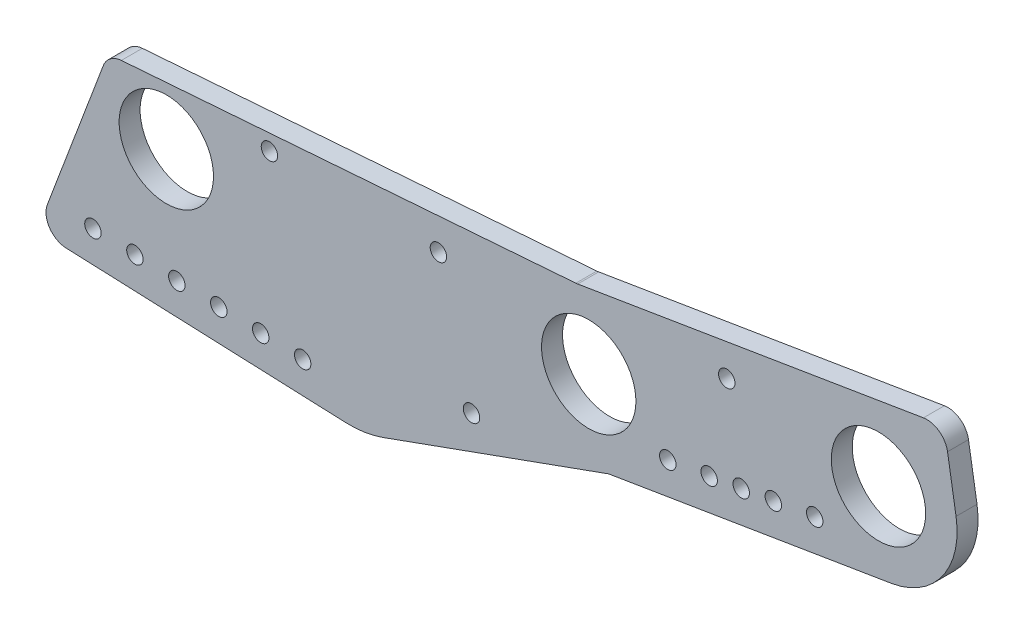
ISO-10303-21;
HEADER;
FILE_DESCRIPTION(('STEP AP214'),'2;1');
FILE_NAME('part.step','',(''),(''),'','','');
FILE_SCHEMA(('AUTOMOTIVE_DESIGN { 1 0 10303 214 1 1 1 1 }'));
ENDSEC;
DATA;
#1=APPLICATION_CONTEXT('core data for automotive mechanical design processes');
#2=APPLICATION_PROTOCOL_DEFINITION('international standard','automotive_design',2000,#1);
#3=PRODUCT_CONTEXT('',#1,'mechanical');
#4=PRODUCT('Part','Part','',(#3));
#5=PRODUCT_RELATED_PRODUCT_CATEGORY('part','',(#4));
#6=PRODUCT_DEFINITION_FORMATION('','',#4);
#7=PRODUCT_DEFINITION_CONTEXT('part definition',#1,'design');
#8=PRODUCT_DEFINITION('design','',#6,#7);
#9=PRODUCT_DEFINITION_SHAPE('','',#8);
#10=(LENGTH_UNIT() NAMED_UNIT(*) SI_UNIT(.MILLI.,.METRE.));
#11=(NAMED_UNIT(*) PLANE_ANGLE_UNIT() SI_UNIT($,.RADIAN.));
#12=(NAMED_UNIT(*) SI_UNIT($,.STERADIAN.) SOLID_ANGLE_UNIT());
#13=UNCERTAINTY_MEASURE_WITH_UNIT(LENGTH_MEASURE(1.E-05),#10,'distance_accuracy_value','');
#14=(GEOMETRIC_REPRESENTATION_CONTEXT(3) GLOBAL_UNCERTAINTY_ASSIGNED_CONTEXT((#13)) GLOBAL_UNIT_ASSIGNED_CONTEXT((#10,
#11,#12)) REPRESENTATION_CONTEXT('',''));
#15=CARTESIAN_POINT('',(0.,0.,0.));
#16=DIRECTION('',(0.,0.,1.));
#17=DIRECTION('',(1.,0.,0.));
#18=AXIS2_PLACEMENT_3D('',#15,#16,#17);
#19=CARTESIAN_POINT('',(731.086148501209,120.401814602592,6.35));
#20=DIRECTION('',(0.98670854359306,0.162500000001421,0.));
#21=DIRECTION('',(-0.162500000001421,0.98670854359306,0.));
#22=AXIS2_PLACEMENT_3D('',#19,#20,#21);
#23=PLANE('',#22);
#24=DIRECTION('',(0.162500000001421,-0.98670854359306,0.));
#25=VECTOR('',#24,1.);
#26=CARTESIAN_POINT('',(731.086148501209,120.401814602592,0.));
#27=LINE('',#26,#25);
#28=CARTESIAN_POINT('',(709.799094076153,249.657928257665,0.));
#29=VERTEX_POINT('',#28);
#30=CARTESIAN_POINT('',(712.378781576175,233.993930128125,0.));
#31=VERTEX_POINT('',#30);
#32=EDGE_CURVE('E230',#29,#31,#27,.T.);
#33=ORIENTED_EDGE('',*,*,#32,.F.);
#34=DIRECTION('',(0.,0.,-1.));
#35=VECTOR('',#34,1.);
#36=CARTESIAN_POINT('',(709.799094076153,249.657928257665,6.35));
#37=LINE('',#36,#35);
#38=CARTESIAN_POINT('',(709.799094076153,249.657928257665,6.35));
#39=VERTEX_POINT('',#38);
#40=EDGE_CURVE('E339',#29,#39,#37,.F.);
#41=ORIENTED_EDGE('',*,*,#40,.T.);
#42=DIRECTION('',(0.162500000001421,-0.98670854359306,0.));
#43=VECTOR('',#42,1.);
#44=CARTESIAN_POINT('',(731.086148501209,120.401814602592,6.35));
#45=LINE('',#44,#43);
#46=CARTESIAN_POINT('',(712.378781576175,233.993930128125,6.35));
#47=VERTEX_POINT('',#46);
#48=EDGE_CURVE('E356',#39,#47,#45,.T.);
#49=ORIENTED_EDGE('',*,*,#48,.T.);
#50=DIRECTION('',(0.,0.,-1.));
#51=VECTOR('',#50,1.);
#52=CARTESIAN_POINT('',(712.378781576175,233.993930128125,6.35));
#53=LINE('',#52,#51);
#54=EDGE_CURVE('E226',#47,#31,#53,.T.);
#55=ORIENTED_EDGE('',*,*,#54,.T.);
#56=EDGE_LOOP('',(#33,#41,#49,#55));
#57=FACE_BOUND('',#56,.T.);
#58=ADVANCED_FACE('F39',(#57),#23,.T.);
#59=CARTESIAN_POINT('',(-22.3189294250648,135.521712906886,6.35));
#60=DIRECTION('',(0.162500000001425,-0.98670854359306,0.));
#61=DIRECTION('',(0.98670854359306,0.162500000001425,0.));
#62=AXIS2_PLACEMENT_3D('',#59,#60,#61);
#63=PLANE('',#62);
#64=DIRECTION('',(-0.98670854359306,-0.162500000001425,0.));
#65=VECTOR('',#64,1.);
#66=CARTESIAN_POINT('',(-22.3189294250648,135.521712906886,0.));
#67=LINE('',#66,#65);
#68=CARTESIAN_POINT('',(702.501619824328,254.891652509472,0.));
#69=VERTEX_POINT('',#68);
#70=CARTESIAN_POINT('',(597.828085962466,237.653077488359,0.));
#71=VERTEX_POINT('',#70);
#72=EDGE_CURVE('E232',#69,#71,#67,.T.);
#73=ORIENTED_EDGE('',*,*,#72,.T.);
#74=DIRECTION('',(0.,0.,-1.));
#75=VECTOR('',#74,1.);
#76=CARTESIAN_POINT('',(597.828085962466,237.653077488359,6.35));
#77=LINE('',#76,#75);
#78=CARTESIAN_POINT('',(597.828085962466,237.653077488359,6.35));
#79=VERTEX_POINT('',#78);
#80=EDGE_CURVE('E337',#71,#79,#77,.F.);
#81=ORIENTED_EDGE('',*,*,#80,.T.);
#82=DIRECTION('',(-0.98670854359306,-0.162500000001425,0.));
#83=VECTOR('',#82,1.);
#84=CARTESIAN_POINT('',(-22.3189294250648,135.521712906886,6.35));
#85=LINE('',#84,#83);
#86=CARTESIAN_POINT('',(702.501619824328,254.891652509472,6.35));
#87=VERTEX_POINT('',#86);
#88=EDGE_CURVE('E355',#87,#79,#85,.T.);
#89=ORIENTED_EDGE('',*,*,#88,.F.);
#90=DIRECTION('',(0.,0.,-1.));
#91=VECTOR('',#90,1.);
#92=CARTESIAN_POINT('',(702.501619824328,254.891652509472,0.));
#93=LINE('',#92,#91);
#94=EDGE_CURVE('E334',#87,#69,#93,.T.);
#95=ORIENTED_EDGE('',*,*,#94,.T.);
#96=EDGE_LOOP('',(#73,#81,#89,#95));
#97=FACE_BOUND('',#96,.T.);
#98=ADVANCED_FACE('F349',(#97),#63,.F.);
#99=CARTESIAN_POINT('',(-14.459718888584,191.363027089175,6.35));
#100=DIRECTION('',(0.0753469237298335,-0.997157380298842,0.));
#101=DIRECTION('',(0.997157380298843,0.0753469237298336,0.));
#102=AXIS2_PLACEMENT_3D('',#99,#100,#101);
#103=PLANE('',#102);
#104=DIRECTION('',(-0.997157380298843,-0.0753469237298336,0.));
#105=VECTOR('',#104,1.);
#106=CARTESIAN_POINT('',(-14.459718888584,191.363027089175,0.));
#107=LINE('',#106,#105);
#108=CARTESIAN_POINT('',(597.274663928142,237.586727375277,0.));
#109=VERTEX_POINT('',#108);
#110=CARTESIAN_POINT('',(459.657757721255,227.188157660236,0.));
#111=VERTEX_POINT('',#110);
#112=EDGE_CURVE('E235',#109,#111,#107,.T.);
#113=ORIENTED_EDGE('',*,*,#112,.T.);
#114=DIRECTION('',(0.,0.,-1.));
#115=VECTOR('',#114,1.);
#116=CARTESIAN_POINT('',(459.657757721255,227.188157660236,6.35));
#117=LINE('',#116,#115);
#118=CARTESIAN_POINT('',(459.657757721255,227.188157660236,6.35));
#119=VERTEX_POINT('',#118);
#120=EDGE_CURVE('E54',#111,#119,#117,.F.);
#121=ORIENTED_EDGE('',*,*,#120,.T.);
#122=DIRECTION('',(-0.997157380298843,-0.0753469237298336,0.));
#123=VECTOR('',#122,1.);
#124=CARTESIAN_POINT('',(-14.459718888584,191.363027089175,6.35));
#125=LINE('',#124,#123);
#126=CARTESIAN_POINT('',(597.274663928142,237.586727375277,6.35));
#127=VERTEX_POINT('',#126);
#128=EDGE_CURVE('E164',#127,#119,#125,.T.);
#129=ORIENTED_EDGE('',*,*,#128,.F.);
#130=DIRECTION('',(0.,0.,-1.));
#131=VECTOR('',#130,1.);
#132=CARTESIAN_POINT('',(597.274663928142,237.586727375277,0.));
#133=LINE('',#132,#131);
#134=EDGE_CURVE('E330',#127,#109,#133,.T.);
#135=ORIENTED_EDGE('',*,*,#134,.T.);
#136=EDGE_LOOP('',(#113,#121,#129,#135));
#137=FACE_BOUND('',#136,.T.);
#138=ADVANCED_FACE('F353',(#137),#103,.F.);
#139=CARTESIAN_POINT('',(323.84992601956,-122.236055832937,6.35));
#140=DIRECTION('',(0.93557448460012,-0.353129415038198,0.));
#141=DIRECTION('',(0.353129415038198,0.93557448460012,0.));
#142=AXIS2_PLACEMENT_3D('',#139,#140,#141);
#143=PLANE('',#142);
#144=DIRECTION('',(-0.353129415038198,-0.93557448460012,0.));
#145=VECTOR('',#144,1.);
#146=CARTESIAN_POINT('',(323.84992601956,-122.236055832937,0.));
#147=LINE('',#146,#145);
#148=CARTESIAN_POINT('',(454.195312709729,223.098580080831,0.));
#149=VERTEX_POINT('',#148);
#150=CARTESIAN_POINT('',(437.251419805367,178.207746307033,0.));
#151=VERTEX_POINT('',#150);
#152=EDGE_CURVE('E237',#149,#151,#147,.T.);
#153=ORIENTED_EDGE('',*,*,#152,.T.);
#154=DIRECTION('',(0.,0.,-1.));
#155=VECTOR('',#154,1.);
#156=CARTESIAN_POINT('',(437.251419805367,178.207746307033,6.35));
#157=LINE('',#156,#155);
#158=CARTESIAN_POINT('',(437.251419805367,178.207746307033,6.35));
#159=VERTEX_POINT('',#158);
#160=EDGE_CURVE('E323',#151,#159,#157,.F.);
#161=ORIENTED_EDGE('',*,*,#160,.T.);
#162=DIRECTION('',(-0.353129415038198,-0.93557448460012,0.));
#163=VECTOR('',#162,1.);
#164=CARTESIAN_POINT('',(323.84992601956,-122.236055832937,6.35));
#165=LINE('',#164,#163);
#166=CARTESIAN_POINT('',(454.195312709729,223.098580080831,6.35));
#167=VERTEX_POINT('',#166);
#168=EDGE_CURVE('E162',#167,#159,#165,.T.);
#169=ORIENTED_EDGE('',*,*,#168,.F.);
#170=DIRECTION('',(0.,0.,-1.));
#171=VECTOR('',#170,1.);
#172=CARTESIAN_POINT('',(454.195312709729,223.098580080831,6.35));
#173=LINE('',#172,#171);
#174=EDGE_CURVE('E320',#167,#149,#173,.T.);
#175=ORIENTED_EDGE('',*,*,#174,.T.);
#176=EDGE_LOOP('',(#153,#161,#169,#175));
#177=FACE_BOUND('',#176,.T.);
#178=ADVANCED_FACE('F417',(#177),#143,.F.);
#179=CARTESIAN_POINT('',(7.59175111134498,187.269085626472,6.35));
#180=DIRECTION('',(-0.0405059943618341,-0.999179295432386,0.));
#181=DIRECTION('',(0.999179295432386,-0.0405059943618341,0.));
#182=AXIS2_PLACEMENT_3D('',#179,#180,#181);
#183=PLANE('',#182);
#184=DIRECTION('',(-0.999179295432386,0.0405059943618341,0.));
#185=VECTOR('',#184,1.);
#186=CARTESIAN_POINT('',(7.59175111134498,187.269085626472,6.35));
#187=LINE('',#186,#185);
#188=CARTESIAN_POINT('',(527.540087078002,166.190762185036,6.35));
#189=VERTEX_POINT('',#188);
#190=CARTESIAN_POINT('',(442.93510471838,169.620585995545,6.35));
#191=VERTEX_POINT('',#190);
#192=EDGE_CURVE('E139',#189,#191,#187,.T.);
#193=ORIENTED_EDGE('',*,*,#192,.T.);
#194=DIRECTION('',(0.,0.,-1.));
#195=VECTOR('',#194,1.);
#196=CARTESIAN_POINT('',(442.93510471838,169.620585995545,0.));
#197=LINE('',#196,#195);
#198=CARTESIAN_POINT('',(442.93510471838,169.620585995545,0.));
#199=VERTEX_POINT('',#198);
#200=EDGE_CURVE('E146',#191,#199,#197,.T.);
#201=ORIENTED_EDGE('',*,*,#200,.T.);
#202=DIRECTION('',(-0.999179295432386,0.0405059943618341,0.));
#203=VECTOR('',#202,1.);
#204=CARTESIAN_POINT('',(7.59175111134498,187.269085626472,0.));
#205=LINE('',#204,#203);
#206=CARTESIAN_POINT('',(527.540087078002,166.190762185036,0.));
#207=VERTEX_POINT('',#206);
#208=EDGE_CURVE('E142',#207,#199,#205,.T.);
#209=ORIENTED_EDGE('',*,*,#208,.F.);
#210=DIRECTION('',(0.,0.,-1.));
#211=VECTOR('',#210,1.);
#212=CARTESIAN_POINT('',(527.540087078002,166.190762185036,6.35));
#213=LINE('',#212,#211);
#214=EDGE_CURVE('E134',#189,#207,#213,.T.);
#215=ORIENTED_EDGE('',*,*,#214,.F.);
#216=EDGE_LOOP('',(#193,#201,#209,#215));
#217=FACE_BOUND('',#216,.T.);
#218=ADVANCED_FACE('F136',(#217),#183,.T.);
#219=CARTESIAN_POINT('',(528.755266906589,196.166140992053,6.35));
#220=DIRECTION('',(0.,0.,-1.));
#221=DIRECTION('',(-1.,0.,0.));
#222=AXIS2_PLACEMENT_3D('',#219,#220,#221);
#223=CYLINDRICAL_SURFACE('',#222,29.9999999440001);
#224=CARTESIAN_POINT('',(528.755266906589,196.166140992053,0.));
#225=DIRECTION('',(0.,0.,1.));
#226=DIRECTION('',(1.,0.,0.));
#227=AXIS2_PLACEMENT_3D('',#224,#225,#226);
#228=CIRCLE('',#227,29.9999999440001);
#229=CARTESIAN_POINT('',(538.924298870388,167.942201055198,0.));
#230=VERTEX_POINT('',#229);
#231=EDGE_CURVE('E241',#207,#230,#228,.T.);
#232=ORIENTED_EDGE('',*,*,#231,.T.);
#233=DIRECTION('',(0.,0.,-1.));
#234=VECTOR('',#233,1.);
#235=CARTESIAN_POINT('',(538.924298870388,167.942201055198,6.35));
#236=LINE('',#235,#234);
#237=CARTESIAN_POINT('',(538.924298870388,167.942201055198,6.35));
#238=VERTEX_POINT('',#237);
#239=EDGE_CURVE('E147',#238,#230,#236,.T.);
#240=ORIENTED_EDGE('',*,*,#239,.F.);
#241=CARTESIAN_POINT('',(528.755266906589,196.166140992053,6.35));
#242=DIRECTION('',(0.,0.,1.));
#243=DIRECTION('',(1.,0.,0.));
#244=AXIS2_PLACEMENT_3D('',#241,#242,#243);
#245=CIRCLE('',#244,29.9999999440001);
#246=EDGE_CURVE('E151',#189,#238,#245,.T.);
#247=ORIENTED_EDGE('',*,*,#246,.F.);
#248=ORIENTED_EDGE('',*,*,#214,.T.);
#249=EDGE_LOOP('',(#232,#240,#247,#248));
#250=FACE_BOUND('',#249,.T.);
#251=ADVANCED_FACE('F152',(#250),#223,.T.);
#252=CARTESIAN_POINT('',(8.36513414818035,-23.217258496429,6.35));
#253=DIRECTION('',(-0.338967732759388,0.940797999651339,0.));
#254=DIRECTION('',(-0.940797999651339,-0.338967732759388,0.));
#255=AXIS2_PLACEMENT_3D('',#252,#253,#254);
#256=PLANE('',#255);
#257=DIRECTION('',(0.940797999651339,0.338967732759388,0.));
#258=VECTOR('',#257,1.);
#259=CARTESIAN_POINT('',(8.36513414818035,-23.217258496429,0.));
#260=LINE('',#259,#258);
#261=CARTESIAN_POINT('',(607.185039610242,192.536416321003,0.));
#262=VERTEX_POINT('',#261);
#263=EDGE_CURVE('E243',#230,#262,#260,.T.);
#264=ORIENTED_EDGE('',*,*,#263,.T.);
#265=DIRECTION('',(0.,0.,-1.));
#266=VECTOR('',#265,1.);
#267=CARTESIAN_POINT('',(607.185039610242,192.536416321003,6.35));
#268=LINE('',#267,#266);
#269=CARTESIAN_POINT('',(607.185039610242,192.536416321003,6.35));
#270=VERTEX_POINT('',#269);
#271=EDGE_CURVE('E309',#270,#262,#268,.T.);
#272=ORIENTED_EDGE('',*,*,#271,.F.);
#273=DIRECTION('',(0.940797999651339,0.338967732759388,0.));
#274=VECTOR('',#273,1.);
#275=CARTESIAN_POINT('',(8.36513414818035,-23.217258496429,6.35));
#276=LINE('',#275,#274);
#277=EDGE_CURVE('E155',#238,#270,#276,.T.);
#278=ORIENTED_EDGE('',*,*,#277,.F.);
#279=ORIENTED_EDGE('',*,*,#239,.T.);
#280=EDGE_LOOP('',(#264,#272,#278,#279));
#281=FACE_BOUND('',#280,.T.);
#282=ADVANCED_FACE('F413',(#281),#256,.F.);
#283=CARTESIAN_POINT('',(-14.8378356749993,90.0961183312208,6.35));
#284=DIRECTION('',(-0.162500000001424,0.98670854359306,0.));
#285=DIRECTION('',(-0.98670854359306,-0.162500000001424,0.));
#286=AXIS2_PLACEMENT_3D('',#283,#284,#285);
#287=PLANE('',#286);
#288=DIRECTION('',(0.98670854359306,0.162500000001424,0.));
#289=VECTOR('',#288,1.);
#290=CARTESIAN_POINT('',(-14.8378356749993,90.0961183312208,0.));
#291=LINE('',#290,#289);
#292=CARTESIAN_POINT('',(692.7523156319,206.628401683781,0.));
#293=VERTEX_POINT('',#292);
#294=EDGE_CURVE('E246',#262,#293,#291,.T.);
#295=ORIENTED_EDGE('',*,*,#294,.T.);
#296=DIRECTION('',(0.,0.,-1.));
#297=VECTOR('',#296,1.);
#298=CARTESIAN_POINT('',(692.7523156319,206.628401683781,6.35));
#299=LINE('',#298,#297);
#300=CARTESIAN_POINT('',(692.7523156319,206.628401683781,6.35));
#301=VERTEX_POINT('',#300);
#302=EDGE_CURVE('E306',#301,#293,#299,.T.);
#303=ORIENTED_EDGE('',*,*,#302,.F.);
#304=DIRECTION('',(0.98670854359306,0.162500000001424,0.));
#305=VECTOR('',#304,1.);
#306=CARTESIAN_POINT('',(-14.8378356749993,90.0961183312208,6.35));
#307=LINE('',#306,#305);
#308=EDGE_CURVE('E169',#270,#301,#307,.T.);
#309=ORIENTED_EDGE('',*,*,#308,.F.);
#310=ORIENTED_EDGE('',*,*,#271,.T.);
#311=EDGE_LOOP('',(#295,#303,#309,#310));
#312=FACE_BOUND('',#311,.T.);
#313=ADVANCED_FACE('F410',(#312),#287,.F.);
#314=CARTESIAN_POINT('',(473.272722320102,210.704647007323,6.35));
#315=DIRECTION('',(0.,0.,-1.));
#316=DIRECTION('',(-1.,0.,0.));
#317=AXIS2_PLACEMENT_3D('',#314,#315,#316);
#318=CYLINDRICAL_SURFACE('',#317,14.2875);
#319=CARTESIAN_POINT('',(473.272722320102,210.704647007323,6.35));
#320=DIRECTION('',(0.,0.,1.));
#321=DIRECTION('',(1.,0.,0.));
#322=AXIS2_PLACEMENT_3D('',#319,#320,#321);
#323=CIRCLE('',#322,14.2875);
#324=CARTESIAN_POINT('',(487.560222320102,210.704647007323,6.35));
#325=VERTEX_POINT('',#324);
#326=EDGE_CURVE('E220',#325,#325,#323,.T.);
#327=ORIENTED_EDGE('',*,*,#326,.T.);
#328=EDGE_LOOP('',(#327));
#329=FACE_BOUND('',#328,.T.);
#330=CARTESIAN_POINT('',(473.272722320102,210.704647007323,0.));
#331=DIRECTION('',(0.,0.,1.));
#332=DIRECTION('',(1.,0.,0.));
#333=AXIS2_PLACEMENT_3D('',#330,#331,#332);
#334=CIRCLE('',#333,14.2875);
#335=CARTESIAN_POINT('',(487.560222320102,210.704647007323,0.));
#336=VERTEX_POINT('',#335);
#337=EDGE_CURVE('E297',#336,#336,#334,.T.);
#338=ORIENTED_EDGE('',*,*,#337,.F.);
#339=EDGE_LOOP('',(#338));
#340=FACE_BOUND('',#339,.T.);
#341=ADVANCED_FACE('F434',(#329,#340),#318,.F.);
#342=CARTESIAN_POINT('',(501.856847350897,176.764765481419,6.35));
#343=DIRECTION('',(0.,0.,-1.));
#344=DIRECTION('',(-1.,0.,0.));
#345=AXIS2_PLACEMENT_3D('',#342,#343,#344);
#346=CYLINDRICAL_SURFACE('',#345,2.48919999999995);
#347=CARTESIAN_POINT('',(501.856847350897,176.764765481419,6.35));
#348=DIRECTION('',(0.,0.,1.));
#349=DIRECTION('',(1.,0.,0.));
#350=AXIS2_PLACEMENT_3D('',#347,#348,#349);
#351=CIRCLE('',#350,2.48919999999995);
#352=CARTESIAN_POINT('',(504.346047350897,176.764765481419,6.35));
#353=VERTEX_POINT('',#352);
#354=EDGE_CURVE('E217',#353,#353,#351,.T.);
#355=ORIENTED_EDGE('',*,*,#354,.T.);
#356=EDGE_LOOP('',(#355));
#357=FACE_BOUND('',#356,.T.);
#358=CARTESIAN_POINT('',(501.856847350897,176.764765481419,0.));
#359=DIRECTION('',(0.,0.,1.));
#360=DIRECTION('',(1.,0.,0.));
#361=AXIS2_PLACEMENT_3D('',#358,#359,#360);
#362=CIRCLE('',#361,2.48919999999995);
#363=CARTESIAN_POINT('',(504.346047350897,176.764765481419,0.));
#364=VERTEX_POINT('',#363);
#365=EDGE_CURVE('E294',#364,#364,#362,.T.);
#366=ORIENTED_EDGE('',*,*,#365,.F.);
#367=EDGE_LOOP('',(#366));
#368=FACE_BOUND('',#367,.T.);
#369=ADVANCED_FACE('F492',(#357,#368),#346,.F.);
#370=CARTESIAN_POINT('',(451.05860344781,178.824088958732,6.35));
#371=DIRECTION('',(0.,0.,-1.));
#372=DIRECTION('',(-1.,0.,0.));
#373=AXIS2_PLACEMENT_3D('',#370,#371,#372);
#374=CYLINDRICAL_SURFACE('',#373,2.48920000000001);
#375=CARTESIAN_POINT('',(451.05860344781,178.824088958732,6.35));
#376=DIRECTION('',(0.,0.,1.));
#377=DIRECTION('',(1.,0.,0.));
#378=AXIS2_PLACEMENT_3D('',#375,#376,#377);
#379=CIRCLE('',#378,2.48920000000001);
#380=CARTESIAN_POINT('',(453.54780344781,178.824088958732,6.35));
#381=VERTEX_POINT('',#380);
#382=EDGE_CURVE('E214',#381,#381,#379,.T.);
#383=ORIENTED_EDGE('',*,*,#382,.T.);
#384=EDGE_LOOP('',(#383));
#385=FACE_BOUND('',#384,.T.);
#386=CARTESIAN_POINT('',(451.05860344781,178.824088958732,0.));
#387=DIRECTION('',(0.,0.,1.));
#388=DIRECTION('',(1.,0.,0.));
#389=AXIS2_PLACEMENT_3D('',#386,#387,#388);
#390=CIRCLE('',#389,2.48920000000001);
#391=CARTESIAN_POINT('',(453.54780344781,178.824088958732,0.));
#392=VERTEX_POINT('',#391);
#393=EDGE_CURVE('E291',#392,#392,#390,.T.);
#394=ORIENTED_EDGE('',*,*,#393,.F.);
#395=EDGE_LOOP('',(#394));
#396=FACE_BOUND('',#395,.T.);
#397=ADVANCED_FACE('F488',(#385,#396),#374,.F.);
#398=CARTESIAN_POINT('',(555.654209420217,224.889661233506,6.35));
#399=DIRECTION('',(0.,0.,-1.));
#400=DIRECTION('',(-1.,0.,0.));
#401=AXIS2_PLACEMENT_3D('',#398,#399,#400);
#402=CYLINDRICAL_SURFACE('',#401,2.48919999999994);
#403=CARTESIAN_POINT('',(555.654209420217,224.889661233506,6.35));
#404=DIRECTION('',(0.,0.,1.));
#405=DIRECTION('',(1.,0.,0.));
#406=AXIS2_PLACEMENT_3D('',#403,#404,#405);
#407=CIRCLE('',#406,2.48919999999994);
#408=CARTESIAN_POINT('',(558.143409420217,224.889661233506,6.35));
#409=VERTEX_POINT('',#408);
#410=EDGE_CURVE('E211',#409,#409,#407,.T.);
#411=ORIENTED_EDGE('',*,*,#410,.T.);
#412=EDGE_LOOP('',(#411));
#413=FACE_BOUND('',#412,.T.);
#414=CARTESIAN_POINT('',(555.654209420217,224.889661233506,0.));
#415=DIRECTION('',(0.,0.,1.));
#416=DIRECTION('',(1.,0.,0.));
#417=AXIS2_PLACEMENT_3D('',#414,#415,#416);
#418=CIRCLE('',#417,2.48919999999994);
#419=CARTESIAN_POINT('',(558.143409420217,224.889661233506,0.));
#420=VERTEX_POINT('',#419);
#421=EDGE_CURVE('E288',#420,#420,#418,.T.);
#422=ORIENTED_EDGE('',*,*,#421,.F.);
#423=EDGE_LOOP('',(#422));
#424=FACE_BOUND('',#423,.T.);
#425=ADVANCED_FACE('F484',(#413,#424),#402,.F.);
#426=CARTESIAN_POINT('',(565.674425613275,187.704604695461,6.35));
#427=DIRECTION('',(0.,0.,-1.));
#428=DIRECTION('',(-1.,0.,0.));
#429=AXIS2_PLACEMENT_3D('',#426,#427,#428);
#430=CYLINDRICAL_SURFACE('',#429,2.48919999999973);
#431=CARTESIAN_POINT('',(565.674425613275,187.704604695461,6.35));
#432=DIRECTION('',(0.,0.,1.));
#433=DIRECTION('',(1.,0.,0.));
#434=AXIS2_PLACEMENT_3D('',#431,#432,#433);
#435=CIRCLE('',#434,2.48919999999973);
#436=CARTESIAN_POINT('',(568.163625613275,187.704604695461,6.35));
#437=VERTEX_POINT('',#436);
#438=EDGE_CURVE('E208',#437,#437,#435,.T.);
#439=ORIENTED_EDGE('',*,*,#438,.T.);
#440=EDGE_LOOP('',(#439));
#441=FACE_BOUND('',#440,.T.);
#442=CARTESIAN_POINT('',(565.674425613275,187.704604695461,0.));
#443=DIRECTION('',(0.,0.,1.));
#444=DIRECTION('',(1.,0.,0.));
#445=AXIS2_PLACEMENT_3D('',#442,#443,#444);
#446=CIRCLE('',#445,2.48919999999973);
#447=CARTESIAN_POINT('',(568.163625613275,187.704604695461,0.));
#448=VERTEX_POINT('',#447);
#449=EDGE_CURVE('E285',#448,#448,#446,.T.);
#450=ORIENTED_EDGE('',*,*,#449,.F.);
#451=EDGE_LOOP('',(#450));
#452=FACE_BOUND('',#451,.T.);
#453=ADVANCED_FACE('F480',(#441,#452),#430,.F.);
#454=CARTESIAN_POINT('',(504.496757790805,225.80019292269,6.35));
#455=DIRECTION('',(0.,0.,-1.));
#456=DIRECTION('',(-1.,0.,0.));
#457=AXIS2_PLACEMENT_3D('',#454,#455,#456);
#458=CYLINDRICAL_SURFACE('',#457,2.48920000000007);
#459=CARTESIAN_POINT('',(504.496757790805,225.80019292269,6.35));
#460=DIRECTION('',(0.,0.,1.));
#461=DIRECTION('',(1.,0.,0.));
#462=AXIS2_PLACEMENT_3D('',#459,#460,#461);
#463=CIRCLE('',#462,2.48920000000007);
#464=CARTESIAN_POINT('',(506.985957790805,225.80019292269,6.35));
#465=VERTEX_POINT('',#464);
#466=EDGE_CURVE('E205',#465,#465,#463,.T.);
#467=ORIENTED_EDGE('',*,*,#466,.T.);
#468=EDGE_LOOP('',(#467));
#469=FACE_BOUND('',#468,.T.);
#470=CARTESIAN_POINT('',(504.496757790805,225.80019292269,0.));
#471=DIRECTION('',(0.,0.,1.));
#472=DIRECTION('',(1.,0.,0.));
#473=AXIS2_PLACEMENT_3D('',#470,#471,#472);
#474=CIRCLE('',#473,2.48920000000007);
#475=CARTESIAN_POINT('',(506.985957790805,225.80019292269,0.));
#476=VERTEX_POINT('',#475);
#477=EDGE_CURVE('E282',#476,#476,#474,.T.);
#478=ORIENTED_EDGE('',*,*,#477,.F.);
#479=EDGE_LOOP('',(#478));
#480=FACE_BOUND('',#479,.T.);
#481=ADVANCED_FACE('F476',(#469,#480),#458,.F.);
#482=CARTESIAN_POINT('',(463.758164423582,178.309258089404,6.35));
#483=DIRECTION('',(0.,0.,-1.));
#484=DIRECTION('',(-1.,0.,0.));
#485=AXIS2_PLACEMENT_3D('',#482,#483,#484);
#486=CYLINDRICAL_SURFACE('',#485,2.48920000000001);
#487=CARTESIAN_POINT('',(463.758164423582,178.309258089404,6.35));
#488=DIRECTION('',(0.,0.,1.));
#489=DIRECTION('',(1.,0.,0.));
#490=AXIS2_PLACEMENT_3D('',#487,#488,#489);
#491=CIRCLE('',#490,2.48920000000001);
#492=CARTESIAN_POINT('',(466.247364423582,178.309258089404,6.35));
#493=VERTEX_POINT('',#492);
#494=EDGE_CURVE('E202',#493,#493,#491,.T.);
#495=ORIENTED_EDGE('',*,*,#494,.T.);
#496=EDGE_LOOP('',(#495));
#497=FACE_BOUND('',#496,.T.);
#498=CARTESIAN_POINT('',(463.758164423582,178.309258089404,0.));
#499=DIRECTION('',(0.,0.,1.));
#500=DIRECTION('',(1.,0.,0.));
#501=AXIS2_PLACEMENT_3D('',#498,#499,#500);
#502=CIRCLE('',#501,2.48920000000001);
#503=CARTESIAN_POINT('',(466.247364423582,178.309258089404,0.));
#504=VERTEX_POINT('',#503);
#505=EDGE_CURVE('E279',#504,#504,#502,.T.);
#506=ORIENTED_EDGE('',*,*,#505,.F.);
#507=EDGE_LOOP('',(#506));
#508=FACE_BOUND('',#507,.T.);
#509=ADVANCED_FACE('F472',(#497,#508),#486,.F.);
#510=CARTESIAN_POINT('',(476.457725399353,177.794427220075,6.35));
#511=DIRECTION('',(0.,0.,-1.));
#512=DIRECTION('',(-1.,0.,0.));
#513=AXIS2_PLACEMENT_3D('',#510,#511,#512);
#514=CYLINDRICAL_SURFACE('',#513,2.48920000000001);
#515=CARTESIAN_POINT('',(476.457725399353,177.794427220075,6.35));
#516=DIRECTION('',(0.,0.,1.));
#517=DIRECTION('',(1.,0.,0.));
#518=AXIS2_PLACEMENT_3D('',#515,#516,#517);
#519=CIRCLE('',#518,2.48920000000001);
#520=CARTESIAN_POINT('',(478.946925399354,177.794427220075,6.35));
#521=VERTEX_POINT('',#520);
#522=EDGE_CURVE('E199',#521,#521,#519,.T.);
#523=ORIENTED_EDGE('',*,*,#522,.T.);
#524=EDGE_LOOP('',(#523));
#525=FACE_BOUND('',#524,.T.);
#526=CARTESIAN_POINT('',(476.457725399353,177.794427220075,0.));
#527=DIRECTION('',(0.,0.,1.));
#528=DIRECTION('',(1.,0.,0.));
#529=AXIS2_PLACEMENT_3D('',#526,#527,#528);
#530=CIRCLE('',#529,2.48920000000001);
#531=CARTESIAN_POINT('',(478.946925399354,177.794427220075,0.));
#532=VERTEX_POINT('',#531);
#533=EDGE_CURVE('E276',#532,#532,#530,.T.);
#534=ORIENTED_EDGE('',*,*,#533,.F.);
#535=EDGE_LOOP('',(#534));
#536=FACE_BOUND('',#535,.T.);
#537=ADVANCED_FACE('F468',(#525,#536),#514,.F.);
#538=CARTESIAN_POINT('',(489.157286375125,177.279596350747,6.35));
#539=DIRECTION('',(0.,0.,-1.));
#540=DIRECTION('',(-1.,0.,0.));
#541=AXIS2_PLACEMENT_3D('',#538,#539,#540);
#542=CYLINDRICAL_SURFACE('',#541,2.48919999999995);
#543=CARTESIAN_POINT('',(489.157286375125,177.279596350747,6.35));
#544=DIRECTION('',(0.,0.,1.));
#545=DIRECTION('',(1.,0.,0.));
#546=AXIS2_PLACEMENT_3D('',#543,#544,#545);
#547=CIRCLE('',#546,2.48919999999995);
#548=CARTESIAN_POINT('',(491.646486375125,177.279596350747,6.35));
#549=VERTEX_POINT('',#548);
#550=EDGE_CURVE('E196',#549,#549,#547,.T.);
#551=ORIENTED_EDGE('',*,*,#550,.T.);
#552=EDGE_LOOP('',(#551));
#553=FACE_BOUND('',#552,.T.);
#554=CARTESIAN_POINT('',(489.157286375125,177.279596350747,0.));
#555=DIRECTION('',(0.,0.,1.));
#556=DIRECTION('',(1.,0.,0.));
#557=AXIS2_PLACEMENT_3D('',#554,#555,#556);
#558=CIRCLE('',#557,2.48919999999995);
#559=CARTESIAN_POINT('',(491.646486375125,177.279596350747,0.));
#560=VERTEX_POINT('',#559);
#561=EDGE_CURVE('E273',#560,#560,#558,.T.);
#562=ORIENTED_EDGE('',*,*,#561,.F.);
#563=EDGE_LOOP('',(#562));
#564=FACE_BOUND('',#563,.T.);
#565=ADVANCED_FACE('F464',(#553,#564),#542,.F.);
#566=CARTESIAN_POINT('',(637.63362952886,207.204269311428,6.35));
#567=DIRECTION('',(0.,0.,-1.));
#568=DIRECTION('',(-1.,0.,0.));
#569=AXIS2_PLACEMENT_3D('',#566,#567,#568);
#570=CYLINDRICAL_SURFACE('',#569,2.48919999999996);
#571=CARTESIAN_POINT('',(637.63362952886,207.204269311428,6.35));
#572=DIRECTION('',(0.,0.,1.));
#573=DIRECTION('',(1.,0.,0.));
#574=AXIS2_PLACEMENT_3D('',#571,#572,#573);
#575=CIRCLE('',#574,2.48919999999996);
#576=CARTESIAN_POINT('',(640.12282952886,207.204269311428,6.35));
#577=VERTEX_POINT('',#576);
#578=EDGE_CURVE('E193',#577,#577,#575,.F.);
#579=ORIENTED_EDGE('',*,*,#578,.F.);
#580=EDGE_LOOP('',(#579));
#581=FACE_BOUND('',#580,.T.);
#582=CARTESIAN_POINT('',(637.63362952886,207.204269311428,0.));
#583=DIRECTION('',(0.,0.,1.));
#584=DIRECTION('',(1.,0.,0.));
#585=AXIS2_PLACEMENT_3D('',#582,#583,#584);
#586=CIRCLE('',#585,2.48919999999996);
#587=CARTESIAN_POINT('',(640.12282952886,207.204269311428,0.));
#588=VERTEX_POINT('',#587);
#589=EDGE_CURVE('E270',#588,#588,#586,.F.);
#590=ORIENTED_EDGE('',*,*,#589,.T.);
#591=EDGE_LOOP('',(#590));
#592=FACE_BOUND('',#591,.T.);
#593=ADVANCED_FACE('F460',(#581,#592),#570,.F.);
#594=CARTESIAN_POINT('',(669.588185713121,212.466831811474,6.35));
#595=DIRECTION('',(0.,0.,-1.));
#596=DIRECTION('',(-1.,0.,0.));
#597=AXIS2_PLACEMENT_3D('',#594,#595,#596);
#598=CYLINDRICAL_SURFACE('',#597,2.48920000000008);
#599=CARTESIAN_POINT('',(669.588185713121,212.466831811474,6.35));
#600=DIRECTION('',(0.,0.,1.));
#601=DIRECTION('',(1.,0.,0.));
#602=AXIS2_PLACEMENT_3D('',#599,#600,#601);
#603=CIRCLE('',#602,2.48920000000008);
#604=CARTESIAN_POINT('',(672.077385713121,212.466831811474,6.35));
#605=VERTEX_POINT('',#604);
#606=EDGE_CURVE('E190',#605,#605,#603,.T.);
#607=ORIENTED_EDGE('',*,*,#606,.T.);
#608=EDGE_LOOP('',(#607));
#609=FACE_BOUND('',#608,.T.);
#610=CARTESIAN_POINT('',(669.588185713121,212.466831811474,0.));
#611=DIRECTION('',(0.,0.,1.));
#612=DIRECTION('',(1.,0.,0.));
#613=AXIS2_PLACEMENT_3D('',#610,#611,#612);
#614=CIRCLE('',#613,2.48920000000008);
#615=CARTESIAN_POINT('',(672.077385713121,212.466831811474,0.));
#616=VERTEX_POINT('',#615);
#617=EDGE_CURVE('E267',#616,#616,#614,.T.);
#618=ORIENTED_EDGE('',*,*,#617,.F.);
#619=EDGE_LOOP('',(#618));
#620=FACE_BOUND('',#619,.T.);
#621=ADVANCED_FACE('F456',(#609,#620),#598,.F.);
#622=CARTESIAN_POINT('',(657.056987209489,210.403081811456,6.35));
#623=DIRECTION('',(0.,0.,-1.));
#624=DIRECTION('',(-1.,0.,0.));
#625=AXIS2_PLACEMENT_3D('',#622,#623,#624);
#626=CYLINDRICAL_SURFACE('',#625,2.48920000000008);
#627=CARTESIAN_POINT('',(657.056987209489,210.403081811456,6.35));
#628=DIRECTION('',(0.,0.,1.));
#629=DIRECTION('',(1.,0.,0.));
#630=AXIS2_PLACEMENT_3D('',#627,#628,#629);
#631=CIRCLE('',#630,2.48920000000008);
#632=CARTESIAN_POINT('',(659.546187209489,210.403081811456,6.35));
#633=VERTEX_POINT('',#632);
#634=EDGE_CURVE('E187',#633,#633,#631,.T.);
#635=ORIENTED_EDGE('',*,*,#634,.T.);
#636=EDGE_LOOP('',(#635));
#637=FACE_BOUND('',#636,.T.);
#638=CARTESIAN_POINT('',(657.056987209489,210.403081811456,0.));
#639=DIRECTION('',(0.,0.,1.));
#640=DIRECTION('',(1.,0.,0.));
#641=AXIS2_PLACEMENT_3D('',#638,#639,#640);
#642=CIRCLE('',#641,2.48920000000008);
#643=CARTESIAN_POINT('',(659.546187209489,210.403081811456,0.));
#644=VERTEX_POINT('',#643);
#645=EDGE_CURVE('E264',#644,#644,#642,.T.);
#646=ORIENTED_EDGE('',*,*,#645,.F.);
#647=EDGE_LOOP('',(#646));
#648=FACE_BOUND('',#647,.T.);
#649=ADVANCED_FACE('F452',(#637,#648),#626,.F.);
#650=CARTESIAN_POINT('',(647.345308369175,208.803675561442,6.35));
#651=DIRECTION('',(0.,0.,-1.));
#652=DIRECTION('',(-1.,0.,0.));
#653=AXIS2_PLACEMENT_3D('',#650,#651,#652);
#654=CYLINDRICAL_SURFACE('',#653,2.48920000000006);
#655=CARTESIAN_POINT('',(647.345308369175,208.803675561442,6.35));
#656=DIRECTION('',(0.,0.,1.));
#657=DIRECTION('',(1.,0.,0.));
#658=AXIS2_PLACEMENT_3D('',#655,#656,#657);
#659=CIRCLE('',#658,2.48920000000006);
#660=CARTESIAN_POINT('',(649.834508369175,208.803675561442,6.35));
#661=VERTEX_POINT('',#660);
#662=EDGE_CURVE('E184',#661,#661,#659,.T.);
#663=ORIENTED_EDGE('',*,*,#662,.T.);
#664=EDGE_LOOP('',(#663));
#665=FACE_BOUND('',#664,.T.);
#666=CARTESIAN_POINT('',(647.345308369175,208.803675561442,0.));
#667=DIRECTION('',(0.,0.,1.));
#668=DIRECTION('',(1.,0.,0.));
#669=AXIS2_PLACEMENT_3D('',#666,#667,#668);
#670=CIRCLE('',#669,2.48920000000006);
#671=CARTESIAN_POINT('',(649.834508369175,208.803675561442,0.));
#672=VERTEX_POINT('',#671);
#673=EDGE_CURVE('E261',#672,#672,#670,.T.);
#674=ORIENTED_EDGE('',*,*,#673,.F.);
#675=EDGE_LOOP('',(#674));
#676=FACE_BOUND('',#675,.T.);
#677=ADVANCED_FACE('F448',(#665,#676),#654,.F.);
#678=CARTESIAN_POINT('',(642.959839619136,235.43247238166,6.35));
#679=DIRECTION('',(0.,0.,-1.));
#680=DIRECTION('',(-1.,0.,0.));
#681=AXIS2_PLACEMENT_3D('',#678,#679,#680);
#682=CYLINDRICAL_SURFACE('',#681,2.48919999999995);
#683=CARTESIAN_POINT('',(642.959839619136,235.43247238166,6.35));
#684=DIRECTION('',(0.,0.,1.));
#685=DIRECTION('',(1.,0.,0.));
#686=AXIS2_PLACEMENT_3D('',#683,#684,#685);
#687=CIRCLE('',#686,2.48919999999995);
#688=CARTESIAN_POINT('',(645.449039619136,235.43247238166,6.35));
#689=VERTEX_POINT('',#688);
#690=EDGE_CURVE('E181',#689,#689,#687,.T.);
#691=ORIENTED_EDGE('',*,*,#690,.T.);
#692=EDGE_LOOP('',(#691));
#693=FACE_BOUND('',#692,.T.);
#694=CARTESIAN_POINT('',(642.959839619136,235.43247238166,0.));
#695=DIRECTION('',(0.,0.,1.));
#696=DIRECTION('',(1.,0.,0.));
#697=AXIS2_PLACEMENT_3D('',#694,#695,#696);
#698=CIRCLE('',#697,2.48919999999995);
#699=CARTESIAN_POINT('',(645.449039619136,235.43247238166,0.));
#700=VERTEX_POINT('',#699);
#701=EDGE_CURVE('E258',#700,#700,#698,.T.);
#702=ORIENTED_EDGE('',*,*,#701,.F.);
#703=EDGE_LOOP('',(#702));
#704=FACE_BOUND('',#703,.T.);
#705=ADVANCED_FACE('F444',(#693,#704),#682,.F.);
#706=CARTESIAN_POINT('',(688.882784381866,230.124398878091,6.35));
#707=DIRECTION('',(0.,0.,-1.));
#708=DIRECTION('',(-1.,0.,0.));
#709=AXIS2_PLACEMENT_3D('',#706,#707,#708);
#710=CYLINDRICAL_SURFACE('',#709,14.2875000000002);
#711=CARTESIAN_POINT('',(688.882784381866,230.124398878091,6.35));
#712=DIRECTION('',(0.,0.,1.));
#713=DIRECTION('',(1.,0.,0.));
#714=AXIS2_PLACEMENT_3D('',#711,#712,#713);
#715=CIRCLE('',#714,14.2875000000002);
#716=CARTESIAN_POINT('',(703.170284381866,230.124398878091,6.35));
#717=VERTEX_POINT('',#716);
#718=EDGE_CURVE('E178',#717,#717,#715,.T.);
#719=ORIENTED_EDGE('',*,*,#718,.T.);
#720=EDGE_LOOP('',(#719));
#721=FACE_BOUND('',#720,.T.);
#722=CARTESIAN_POINT('',(688.882784381866,230.124398878091,0.));
#723=DIRECTION('',(0.,0.,1.));
#724=DIRECTION('',(1.,0.,0.));
#725=AXIS2_PLACEMENT_3D('',#722,#723,#724);
#726=CIRCLE('',#725,14.2875000000002);
#727=CARTESIAN_POINT('',(703.170284381866,230.124398878091,0.));
#728=VERTEX_POINT('',#727);
#729=EDGE_CURVE('E255',#728,#728,#726,.T.);
#730=ORIENTED_EDGE('',*,*,#729,.F.);
#731=EDGE_LOOP('',(#730));
#732=FACE_BOUND('',#731,.T.);
#733=ADVANCED_FACE('F440',(#721,#732),#710,.F.);
#734=CARTESIAN_POINT('',(601.164394856443,215.678148877964,6.35));
#735=DIRECTION('',(0.,0.,-1.));
#736=DIRECTION('',(-1.,0.,0.));
#737=AXIS2_PLACEMENT_3D('',#734,#735,#736);
#738=CYLINDRICAL_SURFACE('',#737,14.2875);
#739=CARTESIAN_POINT('',(601.164394856443,215.678148877964,6.35));
#740=DIRECTION('',(0.,0.,1.));
#741=DIRECTION('',(1.,0.,0.));
#742=AXIS2_PLACEMENT_3D('',#739,#740,#741);
#743=CIRCLE('',#742,14.2875);
#744=CARTESIAN_POINT('',(615.451894856443,215.678148877964,6.35));
#745=VERTEX_POINT('',#744);
#746=EDGE_CURVE('E175',#745,#745,#743,.T.);
#747=ORIENTED_EDGE('',*,*,#746,.T.);
#748=EDGE_LOOP('',(#747));
#749=FACE_BOUND('',#748,.T.);
#750=CARTESIAN_POINT('',(601.164394856443,215.678148877964,0.));
#751=DIRECTION('',(0.,0.,1.));
#752=DIRECTION('',(1.,0.,0.));
#753=AXIS2_PLACEMENT_3D('',#750,#751,#752);
#754=CIRCLE('',#753,14.2875);
#755=CARTESIAN_POINT('',(615.451894856443,215.678148877964,0.));
#756=VERTEX_POINT('',#755);
#757=EDGE_CURVE('E252',#756,#756,#754,.T.);
#758=ORIENTED_EDGE('',*,*,#757,.F.);
#759=EDGE_LOOP('',(#758));
#760=FACE_BOUND('',#759,.T.);
#761=ADVANCED_FACE('F437',(#749,#760),#738,.F.);
#762=CARTESIAN_POINT('',(688.882784381866,230.124398878091,6.35));
#763=DIRECTION('',(0.,0.,-1.));
#764=DIRECTION('',(-1.,0.,0.));
#765=AXIS2_PLACEMENT_3D('',#762,#763,#764);
#766=CYLINDRICAL_SURFACE('',#765,23.8125000000001);
#767=CARTESIAN_POINT('',(688.882784381866,230.124398878091,0.));
#768=DIRECTION('',(0.,0.,1.));
#769=DIRECTION('',(1.,0.,0.));
#770=AXIS2_PLACEMENT_3D('',#767,#768,#769);
#771=CIRCLE('',#770,23.8125000000001);
#772=EDGE_CURVE('E249',#293,#31,#771,.T.);
#773=ORIENTED_EDGE('',*,*,#772,.T.);
#774=ORIENTED_EDGE('',*,*,#54,.F.);
#775=CARTESIAN_POINT('',(688.882784381866,230.124398878091,6.35));
#776=DIRECTION('',(0.,0.,1.));
#777=DIRECTION('',(1.,0.,0.));
#778=AXIS2_PLACEMENT_3D('',#775,#776,#777);
#779=CIRCLE('',#778,23.8125000000001);
#780=EDGE_CURVE('E172',#301,#47,#779,.T.);
#781=ORIENTED_EDGE('',*,*,#780,.F.);
#782=ORIENTED_EDGE('',*,*,#302,.T.);
#783=EDGE_LOOP('',(#773,#774,#781,#782));
#784=FACE_BOUND('',#783,.T.);
#785=ADVANCED_FACE('F368',(#784),#766,.T.);
#786=CARTESIAN_POINT('',(625.102431025228,205.14051931141,6.35));
#787=DIRECTION('',(0.,0.,-1.));
#788=DIRECTION('',(-1.,0.,0.));
#789=AXIS2_PLACEMENT_3D('',#786,#787,#788);
#790=CYLINDRICAL_SURFACE('',#789,2.48919999999996);
#791=CARTESIAN_POINT('',(625.102431025228,205.14051931141,6.35));
#792=DIRECTION('',(0.,0.,1.));
#793=DIRECTION('',(1.,0.,0.));
#794=AXIS2_PLACEMENT_3D('',#791,#792,#793);
#795=CIRCLE('',#794,2.48919999999996);
#796=CARTESIAN_POINT('',(627.591631025228,205.14051931141,6.35));
#797=VERTEX_POINT('',#796);
#798=EDGE_CURVE('E303',#797,#797,#795,.F.);
#799=ORIENTED_EDGE('',*,*,#798,.F.);
#800=EDGE_LOOP('',(#799));
#801=FACE_BOUND('',#800,.T.);
#802=CARTESIAN_POINT('',(625.102431025228,205.14051931141,0.));
#803=DIRECTION('',(0.,0.,1.));
#804=DIRECTION('',(1.,0.,0.));
#805=AXIS2_PLACEMENT_3D('',#802,#803,#804);
#806=CIRCLE('',#805,2.48919999999996);
#807=CARTESIAN_POINT('',(627.591631025228,205.14051931141,0.));
#808=VERTEX_POINT('',#807);
#809=EDGE_CURVE('E227',#808,#808,#806,.F.);
#810=ORIENTED_EDGE('',*,*,#809,.T.);
#811=EDGE_LOOP('',(#810));
#812=FACE_BOUND('',#811,.T.);
#813=ADVANCED_FACE('F364',(#801,#812),#790,.F.);
#814=CARTESIAN_POINT('',(514.556408326669,176.24993461209,6.35));
#815=DIRECTION('',(0.,0.,-1.));
#816=DIRECTION('',(-1.,0.,0.));
#817=AXIS2_PLACEMENT_3D('',#814,#815,#816);
#818=CYLINDRICAL_SURFACE('',#817,2.48919999999995);
#819=CARTESIAN_POINT('',(514.556408326669,176.24993461209,6.35));
#820=DIRECTION('',(0.,0.,1.));
#821=DIRECTION('',(1.,0.,0.));
#822=AXIS2_PLACEMENT_3D('',#819,#820,#821);
#823=CIRCLE('',#822,2.48919999999995);
#824=CARTESIAN_POINT('',(517.045608326669,176.24993461209,6.35));
#825=VERTEX_POINT('',#824);
#826=EDGE_CURVE('E223',#825,#825,#823,.T.);
#827=ORIENTED_EDGE('',*,*,#826,.T.);
#828=EDGE_LOOP('',(#827));
#829=FACE_BOUND('',#828,.T.);
#830=CARTESIAN_POINT('',(514.556408326669,176.24993461209,0.));
#831=DIRECTION('',(0.,0.,1.));
#832=DIRECTION('',(1.,0.,0.));
#833=AXIS2_PLACEMENT_3D('',#830,#831,#832);
#834=CIRCLE('',#833,2.48919999999995);
#835=CARTESIAN_POINT('',(517.045608326669,176.24993461209,0.));
#836=VERTEX_POINT('',#835);
#837=EDGE_CURVE('E300',#836,#836,#834,.T.);
#838=ORIENTED_EDGE('',*,*,#837,.F.);
#839=EDGE_LOOP('',(#838));
#840=FACE_BOUND('',#839,.T.);
#841=ADVANCED_FACE('F367',(#829,#840),#818,.F.);
#842=CARTESIAN_POINT('',(0.,0.,6.35));
#843=DIRECTION('',(0.,0.,1.));
#844=DIRECTION('',(1.,0.,0.));
#845=AXIS2_PLACEMENT_3D('',#842,#843,#844);
#846=PLANE('',#845);
#847=ORIENTED_EDGE('',*,*,#798,.T.);
#848=EDGE_LOOP('',(#847));
#849=FACE_BOUND('',#848,.T.);
#850=ORIENTED_EDGE('',*,*,#168,.T.);
#851=CARTESIAN_POINT('',(443.192317782578,175.965374521541,6.35));
#852=DIRECTION('',(0.,0.,1.));
#853=DIRECTION('',(1.,0.,0.));
#854=AXIS2_PLACEMENT_3D('',#851,#852,#853);
#855=CIRCLE('',#854,6.35);
#856=EDGE_CURVE('E161',#159,#191,#855,.T.);
#857=ORIENTED_EDGE('',*,*,#856,.T.);
#858=ORIENTED_EDGE('',*,*,#192,.F.);
#859=ORIENTED_EDGE('',*,*,#246,.T.);
#860=ORIENTED_EDGE('',*,*,#277,.T.);
#861=ORIENTED_EDGE('',*,*,#308,.T.);
#862=ORIENTED_EDGE('',*,*,#780,.T.);
#863=ORIENTED_EDGE('',*,*,#48,.F.);
#864=CARTESIAN_POINT('',(703.533494824337,248.626053257656,6.35));
#865=DIRECTION('',(0.,0.,1.));
#866=DIRECTION('',(1.,0.,0.));
#867=AXIS2_PLACEMENT_3D('',#864,#865,#866);
#868=CIRCLE('',#867,6.35);
#869=EDGE_CURVE('E325',#39,#87,#868,.T.);
#870=ORIENTED_EDGE('',*,*,#869,.T.);
#871=ORIENTED_EDGE('',*,*,#88,.T.);
#872=CARTESIAN_POINT('',(596.796210962457,243.918676740175,6.35));
#873=DIRECTION('',(0.,0.,1.));
#874=DIRECTION('',(1.,0.,0.));
#875=AXIS2_PLACEMENT_3D('',#872,#873,#874);
#876=CIRCLE('',#875,6.35);
#877=EDGE_CURVE('E11',#79,#127,#876,.F.);
#878=ORIENTED_EDGE('',*,*,#877,.T.);
#879=ORIENTED_EDGE('',*,*,#128,.T.);
#880=CARTESIAN_POINT('',(460.13621068694,220.856208295338,6.35));
#881=DIRECTION('',(0.,0.,1.));
#882=DIRECTION('',(1.,0.,0.));
#883=AXIS2_PLACEMENT_3D('',#880,#881,#882);
#884=CIRCLE('',#883,6.35);
#885=EDGE_CURVE('E327',#119,#167,#884,.T.);
#886=ORIENTED_EDGE('',*,*,#885,.T.);
#887=EDGE_LOOP('',(#850,#857,#858,#859,#860,#861,#862,#863,#870,#871,#878,#879,#886));
#888=FACE_BOUND('',#887,.T.);
#889=ORIENTED_EDGE('',*,*,#746,.F.);
#890=EDGE_LOOP('',(#889));
#891=FACE_BOUND('',#890,.T.);
#892=ORIENTED_EDGE('',*,*,#718,.F.);
#893=EDGE_LOOP('',(#892));
#894=FACE_BOUND('',#893,.T.);
#895=ORIENTED_EDGE('',*,*,#690,.F.);
#896=EDGE_LOOP('',(#895));
#897=FACE_BOUND('',#896,.T.);
#898=ORIENTED_EDGE('',*,*,#662,.F.);
#899=EDGE_LOOP('',(#898));
#900=FACE_BOUND('',#899,.T.);
#901=ORIENTED_EDGE('',*,*,#634,.F.);
#902=EDGE_LOOP('',(#901));
#903=FACE_BOUND('',#902,.T.);
#904=ORIENTED_EDGE('',*,*,#606,.F.);
#905=EDGE_LOOP('',(#904));
#906=FACE_BOUND('',#905,.T.);
#907=ORIENTED_EDGE('',*,*,#578,.T.);
#908=EDGE_LOOP('',(#907));
#909=FACE_BOUND('',#908,.T.);
#910=ORIENTED_EDGE('',*,*,#550,.F.);
#911=EDGE_LOOP('',(#910));
#912=FACE_BOUND('',#911,.T.);
#913=ORIENTED_EDGE('',*,*,#522,.F.);
#914=EDGE_LOOP('',(#913));
#915=FACE_BOUND('',#914,.T.);
#916=ORIENTED_EDGE('',*,*,#494,.F.);
#917=EDGE_LOOP('',(#916));
#918=FACE_BOUND('',#917,.T.);
#919=ORIENTED_EDGE('',*,*,#466,.F.);
#920=EDGE_LOOP('',(#919));
#921=FACE_BOUND('',#920,.T.);
#922=ORIENTED_EDGE('',*,*,#438,.F.);
#923=EDGE_LOOP('',(#922));
#924=FACE_BOUND('',#923,.T.);
#925=ORIENTED_EDGE('',*,*,#410,.F.);
#926=EDGE_LOOP('',(#925));
#927=FACE_BOUND('',#926,.T.);
#928=ORIENTED_EDGE('',*,*,#382,.F.);
#929=EDGE_LOOP('',(#928));
#930=FACE_BOUND('',#929,.T.);
#931=ORIENTED_EDGE('',*,*,#354,.F.);
#932=EDGE_LOOP('',(#931));
#933=FACE_BOUND('',#932,.T.);
#934=ORIENTED_EDGE('',*,*,#326,.F.);
#935=EDGE_LOOP('',(#934));
#936=FACE_BOUND('',#935,.T.);
#937=ORIENTED_EDGE('',*,*,#826,.F.);
#938=EDGE_LOOP('',(#937));
#939=FACE_BOUND('',#938,.T.);
#940=ADVANCED_FACE('F158',(#849,#888,#891,#894,#897,#900,#903,#906,#909,#912,#915,#918,#921,
#924,#927,#930,#933,#936,#939),#846,.T.);
#941=CARTESIAN_POINT('',(0.,0.,0.));
#942=DIRECTION('',(0.,0.,1.));
#943=DIRECTION('',(1.,0.,0.));
#944=AXIS2_PLACEMENT_3D('',#941,#942,#943);
#945=PLANE('',#944);
#946=ORIENTED_EDGE('',*,*,#809,.F.);
#947=EDGE_LOOP('',(#946));
#948=FACE_BOUND('',#947,.T.);
#949=ORIENTED_EDGE('',*,*,#208,.T.);
#950=CARTESIAN_POINT('',(443.192317782578,175.965374521541,0.));
#951=DIRECTION('',(0.,0.,1.));
#952=DIRECTION('',(1.,0.,0.));
#953=AXIS2_PLACEMENT_3D('',#950,#951,#952);
#954=CIRCLE('',#953,6.35);
#955=EDGE_CURVE('E318',#199,#151,#954,.F.);
#956=ORIENTED_EDGE('',*,*,#955,.T.);
#957=ORIENTED_EDGE('',*,*,#152,.F.);
#958=CARTESIAN_POINT('',(460.13621068694,220.856208295338,0.));
#959=DIRECTION('',(0.,0.,1.));
#960=DIRECTION('',(1.,0.,0.));
#961=AXIS2_PLACEMENT_3D('',#958,#959,#960);
#962=CIRCLE('',#961,6.35);
#963=EDGE_CURVE('E316',#149,#111,#962,.F.);
#964=ORIENTED_EDGE('',*,*,#963,.T.);
#965=ORIENTED_EDGE('',*,*,#112,.F.);
#966=CARTESIAN_POINT('',(596.796210962457,243.918676740175,0.));
#967=DIRECTION('',(0.,0.,1.));
#968=DIRECTION('',(1.,0.,0.));
#969=AXIS2_PLACEMENT_3D('',#966,#967,#968);
#970=CIRCLE('',#969,6.35);
#971=EDGE_CURVE('E47',#109,#71,#970,.T.);
#972=ORIENTED_EDGE('',*,*,#971,.T.);
#973=ORIENTED_EDGE('',*,*,#72,.F.);
#974=CARTESIAN_POINT('',(703.533494824337,248.626053257656,0.));
#975=DIRECTION('',(0.,0.,1.));
#976=DIRECTION('',(1.,0.,0.));
#977=AXIS2_PLACEMENT_3D('',#974,#975,#976);
#978=CIRCLE('',#977,6.35);
#979=EDGE_CURVE('E314',#69,#29,#978,.F.);
#980=ORIENTED_EDGE('',*,*,#979,.T.);
#981=ORIENTED_EDGE('',*,*,#32,.T.);
#982=ORIENTED_EDGE('',*,*,#772,.F.);
#983=ORIENTED_EDGE('',*,*,#294,.F.);
#984=ORIENTED_EDGE('',*,*,#263,.F.);
#985=ORIENTED_EDGE('',*,*,#231,.F.);
#986=EDGE_LOOP('',(#949,#956,#957,#964,#965,#972,#973,#980,#981,#982,#983,#984,#985));
#987=FACE_BOUND('',#986,.T.);
#988=ORIENTED_EDGE('',*,*,#757,.T.);
#989=EDGE_LOOP('',(#988));
#990=FACE_BOUND('',#989,.T.);
#991=ORIENTED_EDGE('',*,*,#729,.T.);
#992=EDGE_LOOP('',(#991));
#993=FACE_BOUND('',#992,.T.);
#994=ORIENTED_EDGE('',*,*,#701,.T.);
#995=EDGE_LOOP('',(#994));
#996=FACE_BOUND('',#995,.T.);
#997=ORIENTED_EDGE('',*,*,#673,.T.);
#998=EDGE_LOOP('',(#997));
#999=FACE_BOUND('',#998,.T.);
#1000=ORIENTED_EDGE('',*,*,#645,.T.);
#1001=EDGE_LOOP('',(#1000));
#1002=FACE_BOUND('',#1001,.T.);
#1003=ORIENTED_EDGE('',*,*,#617,.T.);
#1004=EDGE_LOOP('',(#1003));
#1005=FACE_BOUND('',#1004,.T.);
#1006=ORIENTED_EDGE('',*,*,#589,.F.);
#1007=EDGE_LOOP('',(#1006));
#1008=FACE_BOUND('',#1007,.T.);
#1009=ORIENTED_EDGE('',*,*,#561,.T.);
#1010=EDGE_LOOP('',(#1009));
#1011=FACE_BOUND('',#1010,.T.);
#1012=ORIENTED_EDGE('',*,*,#533,.T.);
#1013=EDGE_LOOP('',(#1012));
#1014=FACE_BOUND('',#1013,.T.);
#1015=ORIENTED_EDGE('',*,*,#505,.T.);
#1016=EDGE_LOOP('',(#1015));
#1017=FACE_BOUND('',#1016,.T.);
#1018=ORIENTED_EDGE('',*,*,#477,.T.);
#1019=EDGE_LOOP('',(#1018));
#1020=FACE_BOUND('',#1019,.T.);
#1021=ORIENTED_EDGE('',*,*,#449,.T.);
#1022=EDGE_LOOP('',(#1021));
#1023=FACE_BOUND('',#1022,.T.);
#1024=ORIENTED_EDGE('',*,*,#421,.T.);
#1025=EDGE_LOOP('',(#1024));
#1026=FACE_BOUND('',#1025,.T.);
#1027=ORIENTED_EDGE('',*,*,#393,.T.);
#1028=EDGE_LOOP('',(#1027));
#1029=FACE_BOUND('',#1028,.T.);
#1030=ORIENTED_EDGE('',*,*,#365,.T.);
#1031=EDGE_LOOP('',(#1030));
#1032=FACE_BOUND('',#1031,.T.);
#1033=ORIENTED_EDGE('',*,*,#337,.T.);
#1034=EDGE_LOOP('',(#1033));
#1035=FACE_BOUND('',#1034,.T.);
#1036=ORIENTED_EDGE('',*,*,#837,.T.);
#1037=EDGE_LOOP('',(#1036));
#1038=FACE_BOUND('',#1037,.T.);
#1039=ADVANCED_FACE('F343',(#948,#987,#990,#993,#996,#999,#1002,#1005,#1008,#1011,#1014,#1017,
#1020,#1023,#1026,#1029,#1032,#1035,#1038),#945,.F.);
#1040=CARTESIAN_POINT('',(443.192317782578,175.965374521541,6.35));
#1041=DIRECTION('',(0.,0.,1.));
#1042=DIRECTION('',(1.,0.,0.));
#1043=AXIS2_PLACEMENT_3D('',#1040,#1041,#1042);
#1044=CYLINDRICAL_SURFACE('',#1043,6.35);
#1045=ORIENTED_EDGE('',*,*,#856,.F.);
#1046=ORIENTED_EDGE('',*,*,#160,.F.);
#1047=ORIENTED_EDGE('',*,*,#955,.F.);
#1048=ORIENTED_EDGE('',*,*,#200,.F.);
#1049=EDGE_LOOP('',(#1045,#1046,#1047,#1048));
#1050=FACE_BOUND('',#1049,.T.);
#1051=ADVANCED_FACE('F373',(#1050),#1044,.T.);
#1052=CARTESIAN_POINT('',(460.13621068694,220.856208295338,6.35));
#1053=DIRECTION('',(0.,0.,-1.));
#1054=DIRECTION('',(-1.,0.,0.));
#1055=AXIS2_PLACEMENT_3D('',#1052,#1053,#1054);
#1056=CYLINDRICAL_SURFACE('',#1055,6.35);
#1057=ORIENTED_EDGE('',*,*,#885,.F.);
#1058=ORIENTED_EDGE('',*,*,#120,.F.);
#1059=ORIENTED_EDGE('',*,*,#963,.F.);
#1060=ORIENTED_EDGE('',*,*,#174,.F.);
#1061=EDGE_LOOP('',(#1057,#1058,#1059,#1060));
#1062=FACE_BOUND('',#1061,.T.);
#1063=ADVANCED_FACE('F379',(#1062),#1056,.T.);
#1064=CARTESIAN_POINT('',(596.796210962457,243.918676740175,6.35));
#1065=DIRECTION('',(0.,0.,1.));
#1066=DIRECTION('',(1.,0.,0.));
#1067=AXIS2_PLACEMENT_3D('',#1064,#1065,#1066);
#1068=CYLINDRICAL_SURFACE('',#1067,6.35);
#1069=ORIENTED_EDGE('',*,*,#877,.F.);
#1070=ORIENTED_EDGE('',*,*,#80,.F.);
#1071=ORIENTED_EDGE('',*,*,#971,.F.);
#1072=ORIENTED_EDGE('',*,*,#134,.F.);
#1073=EDGE_LOOP('',(#1069,#1070,#1071,#1072));
#1074=FACE_BOUND('',#1073,.T.);
#1075=ADVANCED_FACE('F352',(#1074),#1068,.F.);
#1076=CARTESIAN_POINT('',(703.533494824337,248.626053257656,6.35));
#1077=DIRECTION('',(0.,0.,1.));
#1078=DIRECTION('',(1.,0.,0.));
#1079=AXIS2_PLACEMENT_3D('',#1076,#1077,#1078);
#1080=CYLINDRICAL_SURFACE('',#1079,6.35);
#1081=ORIENTED_EDGE('',*,*,#869,.F.);
#1082=ORIENTED_EDGE('',*,*,#40,.F.);
#1083=ORIENTED_EDGE('',*,*,#979,.F.);
#1084=ORIENTED_EDGE('',*,*,#94,.F.);
#1085=EDGE_LOOP('',(#1081,#1082,#1083,#1084));
#1086=FACE_BOUND('',#1085,.T.);
#1087=ADVANCED_FACE('F41',(#1086),#1080,.T.);
#1088=CLOSED_SHELL('',(#58,#98,#138,#178,#218,#251,#282,#313,#341,#369,#397,#425,#453,#481,#509,
#537,#565,#593,#621,#649,#677,#705,#733,#761,#785,#813,#841,#940,#1039,#1051,#1063,#1075,#1087));
#1089=MANIFOLD_SOLID_BREP('B2',#1088);
#1090=ADVANCED_BREP_SHAPE_REPRESENTATION('',(#18,#1089),#14);
#1091=SHAPE_DEFINITION_REPRESENTATION(#9,#1090);
ENDSEC;
END-ISO-10303-21;
